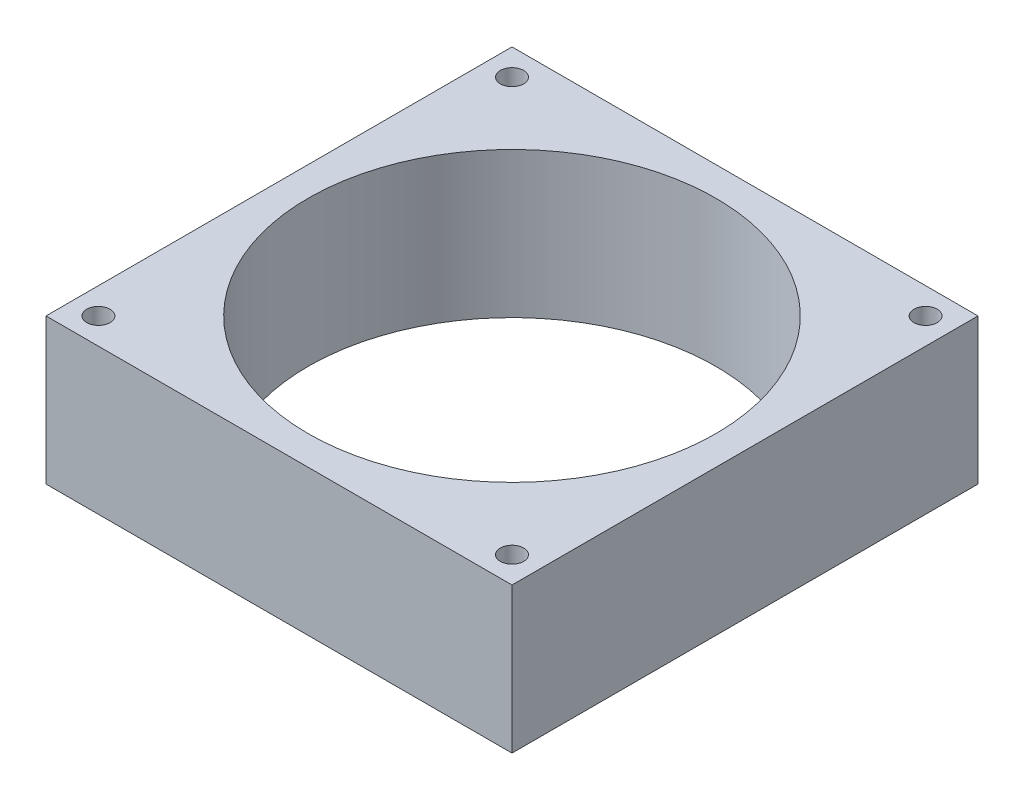
ISO-10303-21;
HEADER;
FILE_DESCRIPTION(('STEP AP214'),'2;1');
FILE_NAME('part.step','',(''),(''),'','','');
FILE_SCHEMA(('AUTOMOTIVE_DESIGN { 1 0 10303 214 1 1 1 1 }'));
ENDSEC;
DATA;
#1=APPLICATION_CONTEXT('core data for automotive mechanical design processes');
#2=APPLICATION_PROTOCOL_DEFINITION('international standard','automotive_design',2000,#1);
#3=PRODUCT_CONTEXT('',#1,'mechanical');
#4=PRODUCT('Part','Part','',(#3));
#5=PRODUCT_RELATED_PRODUCT_CATEGORY('part','',(#4));
#6=PRODUCT_DEFINITION_FORMATION('','',#4);
#7=PRODUCT_DEFINITION_CONTEXT('part definition',#1,'design');
#8=PRODUCT_DEFINITION('design','',#6,#7);
#9=PRODUCT_DEFINITION_SHAPE('','',#8);
#10=(LENGTH_UNIT() NAMED_UNIT(*) SI_UNIT(.MILLI.,.METRE.));
#11=(NAMED_UNIT(*) PLANE_ANGLE_UNIT() SI_UNIT($,.RADIAN.));
#12=(NAMED_UNIT(*) SI_UNIT($,.STERADIAN.) SOLID_ANGLE_UNIT());
#13=UNCERTAINTY_MEASURE_WITH_UNIT(LENGTH_MEASURE(1.E-05),#10,'distance_accuracy_value','');
#14=(GEOMETRIC_REPRESENTATION_CONTEXT(3) GLOBAL_UNCERTAINTY_ASSIGNED_CONTEXT((#13)) GLOBAL_UNIT_ASSIGNED_CONTEXT((#10,
#11,#12)) REPRESENTATION_CONTEXT('',''));
#15=CARTESIAN_POINT('',(0.,0.,0.));
#16=DIRECTION('',(0.,0.,1.));
#17=DIRECTION('',(1.,0.,0.));
#18=AXIS2_PLACEMENT_3D('',#15,#16,#17);
#19=CARTESIAN_POINT('',(0.,25.,0.));
#20=DIRECTION('',(0.,-1.,0.));
#21=DIRECTION('',(0.,0.,-1.));
#22=AXIS2_PLACEMENT_3D('',#19,#20,#21);
#23=PLANE('',#22);
#24=DIRECTION('',(0.,0.,-1.));
#25=VECTOR('',#24,1.);
#26=CARTESIAN_POINT('',(40.,25.,40.));
#27=LINE('',#26,#25);
#28=CARTESIAN_POINT('',(40.,25.,40.));
#29=VERTEX_POINT('',#28);
#30=CARTESIAN_POINT('',(40.,25.,-40.));
#31=VERTEX_POINT('',#30);
#32=EDGE_CURVE('E84',#29,#31,#27,.T.);
#33=ORIENTED_EDGE('',*,*,#32,.T.);
#34=DIRECTION('',(-1.,0.,0.));
#35=VECTOR('',#34,1.);
#36=CARTESIAN_POINT('',(-40.,25.,-40.));
#37=LINE('',#36,#35);
#38=CARTESIAN_POINT('',(-40.,25.,-40.));
#39=VERTEX_POINT('',#38);
#40=EDGE_CURVE('E79',#31,#39,#37,.T.);
#41=ORIENTED_EDGE('',*,*,#40,.T.);
#42=DIRECTION('',(0.,0.,1.));
#43=VECTOR('',#42,1.);
#44=CARTESIAN_POINT('',(-40.,25.,40.));
#45=LINE('',#44,#43);
#46=CARTESIAN_POINT('',(-40.,25.,40.));
#47=VERTEX_POINT('',#46);
#48=EDGE_CURVE('E82',#39,#47,#45,.T.);
#49=ORIENTED_EDGE('',*,*,#48,.T.);
#50=DIRECTION('',(1.,0.,0.));
#51=VECTOR('',#50,1.);
#52=CARTESIAN_POINT('',(-40.,25.,40.));
#53=LINE('',#52,#51);
#54=EDGE_CURVE('E49',#47,#29,#53,.T.);
#55=ORIENTED_EDGE('',*,*,#54,.T.);
#56=EDGE_LOOP('',(#33,#41,#49,#55));
#57=FACE_BOUND('',#56,.T.);
#58=CARTESIAN_POINT('',(-35.5,25.,-35.5));
#59=DIRECTION('',(0.,1.,0.));
#60=DIRECTION('',(0.,0.,1.));
#61=AXIS2_PLACEMENT_3D('',#58,#59,#60);
#62=CIRCLE('',#61,2.);
#63=CARTESIAN_POINT('',(-35.5,25.,-33.5));
#64=VERTEX_POINT('',#63);
#65=EDGE_CURVE('E99',#64,#64,#62,.T.);
#66=ORIENTED_EDGE('',*,*,#65,.F.);
#67=EDGE_LOOP('',(#66));
#68=FACE_BOUND('',#67,.T.);
#69=CARTESIAN_POINT('',(0.,25.,0.));
#70=DIRECTION('',(0.,1.,0.));
#71=DIRECTION('',(0.,0.,1.));
#72=AXIS2_PLACEMENT_3D('',#69,#70,#71);
#73=CIRCLE('',#72,35.);
#74=CARTESIAN_POINT('',(0.,25.,35.));
#75=VERTEX_POINT('',#74);
#76=EDGE_CURVE('E114',#75,#75,#73,.T.);
#77=ORIENTED_EDGE('',*,*,#76,.F.);
#78=EDGE_LOOP('',(#77));
#79=FACE_BOUND('',#78,.T.);
#80=CARTESIAN_POINT('',(35.5,25.,-35.5));
#81=DIRECTION('',(0.,1.,0.));
#82=DIRECTION('',(0.,0.,1.));
#83=AXIS2_PLACEMENT_3D('',#80,#81,#82);
#84=CIRCLE('',#83,2.);
#85=CARTESIAN_POINT('',(35.5,25.,-33.5));
#86=VERTEX_POINT('',#85);
#87=EDGE_CURVE('E120',#86,#86,#84,.T.);
#88=ORIENTED_EDGE('',*,*,#87,.F.);
#89=EDGE_LOOP('',(#88));
#90=FACE_BOUND('',#89,.T.);
#91=CARTESIAN_POINT('',(35.5000000000007,25.,35.5));
#92=DIRECTION('',(0.,1.,0.));
#93=DIRECTION('',(0.,0.,1.));
#94=AXIS2_PLACEMENT_3D('',#91,#92,#93);
#95=CIRCLE('',#94,2.);
#96=CARTESIAN_POINT('',(35.5000000000007,25.,37.5));
#97=VERTEX_POINT('',#96);
#98=EDGE_CURVE('E126',#97,#97,#95,.T.);
#99=ORIENTED_EDGE('',*,*,#98,.F.);
#100=EDGE_LOOP('',(#99));
#101=FACE_BOUND('',#100,.T.);
#102=CARTESIAN_POINT('',(-35.4999999999993,25.,35.5));
#103=DIRECTION('',(0.,1.,0.));
#104=DIRECTION('',(0.,0.,1.));
#105=AXIS2_PLACEMENT_3D('',#102,#103,#104);
#106=CIRCLE('',#105,2.);
#107=CARTESIAN_POINT('',(-35.4999999999993,25.,37.5));
#108=VERTEX_POINT('',#107);
#109=EDGE_CURVE('E132',#108,#108,#106,.T.);
#110=ORIENTED_EDGE('',*,*,#109,.F.);
#111=EDGE_LOOP('',(#110));
#112=FACE_BOUND('',#111,.T.);
#113=ADVANCED_FACE('F32',(#57,#68,#79,#90,#101,#112),#23,.F.);
#114=CARTESIAN_POINT('',(0.,0.,0.));
#115=DIRECTION('',(0.,-1.,0.));
#116=DIRECTION('',(0.,0.,-1.));
#117=AXIS2_PLACEMENT_3D('',#114,#115,#116);
#118=PLANE('',#117);
#119=CARTESIAN_POINT('',(35.5000000000007,0.,35.5));
#120=DIRECTION('',(0.,1.,0.));
#121=DIRECTION('',(0.,0.,1.));
#122=AXIS2_PLACEMENT_3D('',#119,#120,#121);
#123=CIRCLE('',#122,2.);
#124=CARTESIAN_POINT('',(35.5000000000007,0.,37.5));
#125=VERTEX_POINT('',#124);
#126=EDGE_CURVE('E129',#125,#125,#123,.T.);
#127=ORIENTED_EDGE('',*,*,#126,.T.);
#128=EDGE_LOOP('',(#127));
#129=FACE_BOUND('',#128,.T.);
#130=CARTESIAN_POINT('',(0.,0.,0.));
#131=DIRECTION('',(0.,1.,0.));
#132=DIRECTION('',(0.,0.,1.));
#133=AXIS2_PLACEMENT_3D('',#130,#131,#132);
#134=CIRCLE('',#133,35.);
#135=CARTESIAN_POINT('',(0.,0.,35.));
#136=VERTEX_POINT('',#135);
#137=EDGE_CURVE('E117',#136,#136,#134,.T.);
#138=ORIENTED_EDGE('',*,*,#137,.T.);
#139=EDGE_LOOP('',(#138));
#140=FACE_BOUND('',#139,.T.);
#141=DIRECTION('',(0.,0.,-1.));
#142=VECTOR('',#141,1.);
#143=CARTESIAN_POINT('',(40.,0.,40.));
#144=LINE('',#143,#142);
#145=CARTESIAN_POINT('',(40.,0.,40.));
#146=VERTEX_POINT('',#145);
#147=CARTESIAN_POINT('',(40.,0.,-40.));
#148=VERTEX_POINT('',#147);
#149=EDGE_CURVE('E96',#146,#148,#144,.T.);
#150=ORIENTED_EDGE('',*,*,#149,.F.);
#151=DIRECTION('',(1.,0.,0.));
#152=VECTOR('',#151,1.);
#153=CARTESIAN_POINT('',(-40.,0.,40.));
#154=LINE('',#153,#152);
#155=CARTESIAN_POINT('',(-40.,0.,40.));
#156=VERTEX_POINT('',#155);
#157=EDGE_CURVE('E72',#156,#146,#154,.T.);
#158=ORIENTED_EDGE('',*,*,#157,.F.);
#159=DIRECTION('',(0.,0.,1.));
#160=VECTOR('',#159,1.);
#161=CARTESIAN_POINT('',(-40.,0.,40.));
#162=LINE('',#161,#160);
#163=CARTESIAN_POINT('',(-40.,0.,-40.));
#164=VERTEX_POINT('',#163);
#165=EDGE_CURVE('E66',#164,#156,#162,.T.);
#166=ORIENTED_EDGE('',*,*,#165,.F.);
#167=DIRECTION('',(-1.,0.,0.));
#168=VECTOR('',#167,1.);
#169=CARTESIAN_POINT('',(-40.,0.,-40.));
#170=LINE('',#169,#168);
#171=EDGE_CURVE('E88',#148,#164,#170,.T.);
#172=ORIENTED_EDGE('',*,*,#171,.F.);
#173=EDGE_LOOP('',(#150,#158,#166,#172));
#174=FACE_BOUND('',#173,.T.);
#175=CARTESIAN_POINT('',(-35.5,0.,-35.5));
#176=DIRECTION('',(0.,1.,0.));
#177=DIRECTION('',(0.,0.,1.));
#178=AXIS2_PLACEMENT_3D('',#175,#176,#177);
#179=CIRCLE('',#178,2.);
#180=CARTESIAN_POINT('',(-35.5,0.,-33.5));
#181=VERTEX_POINT('',#180);
#182=EDGE_CURVE('E111',#181,#181,#179,.T.);
#183=ORIENTED_EDGE('',*,*,#182,.T.);
#184=EDGE_LOOP('',(#183));
#185=FACE_BOUND('',#184,.T.);
#186=CARTESIAN_POINT('',(35.5,0.,-35.5));
#187=DIRECTION('',(0.,1.,0.));
#188=DIRECTION('',(0.,0.,1.));
#189=AXIS2_PLACEMENT_3D('',#186,#187,#188);
#190=CIRCLE('',#189,2.);
#191=CARTESIAN_POINT('',(35.5,0.,-33.5));
#192=VERTEX_POINT('',#191);
#193=EDGE_CURVE('E123',#192,#192,#190,.T.);
#194=ORIENTED_EDGE('',*,*,#193,.T.);
#195=EDGE_LOOP('',(#194));
#196=FACE_BOUND('',#195,.T.);
#197=CARTESIAN_POINT('',(-35.4999999999993,0.,35.5));
#198=DIRECTION('',(0.,1.,0.));
#199=DIRECTION('',(0.,0.,1.));
#200=AXIS2_PLACEMENT_3D('',#197,#198,#199);
#201=CIRCLE('',#200,2.);
#202=CARTESIAN_POINT('',(-35.4999999999993,0.,37.5));
#203=VERTEX_POINT('',#202);
#204=EDGE_CURVE('E135',#203,#203,#201,.T.);
#205=ORIENTED_EDGE('',*,*,#204,.T.);
#206=EDGE_LOOP('',(#205));
#207=FACE_BOUND('',#206,.T.);
#208=ADVANCED_FACE('F107',(#129,#140,#174,#185,#196,#207),#118,.T.);
#209=CARTESIAN_POINT('',(40.,25.,40.));
#210=DIRECTION('',(-1.,0.,0.));
#211=DIRECTION('',(0.,0.,1.));
#212=AXIS2_PLACEMENT_3D('',#209,#210,#211);
#213=PLANE('',#212);
#214=ORIENTED_EDGE('',*,*,#149,.T.);
#215=DIRECTION('',(0.,-1.,0.));
#216=VECTOR('',#215,1.);
#217=CARTESIAN_POINT('',(40.,25.,-40.));
#218=LINE('',#217,#216);
#219=EDGE_CURVE('E11',#31,#148,#218,.T.);
#220=ORIENTED_EDGE('',*,*,#219,.F.);
#221=ORIENTED_EDGE('',*,*,#32,.F.);
#222=DIRECTION('',(0.,-1.,0.));
#223=VECTOR('',#222,1.);
#224=CARTESIAN_POINT('',(40.,25.,40.));
#225=LINE('',#224,#223);
#226=EDGE_CURVE('E92',#29,#146,#225,.T.);
#227=ORIENTED_EDGE('',*,*,#226,.T.);
#228=EDGE_LOOP('',(#214,#220,#221,#227));
#229=FACE_BOUND('',#228,.T.);
#230=ADVANCED_FACE('F34',(#229),#213,.F.);
#231=CARTESIAN_POINT('',(-40.,25.,-40.));
#232=DIRECTION('',(0.,0.,1.));
#233=DIRECTION('',(1.,0.,0.));
#234=AXIS2_PLACEMENT_3D('',#231,#232,#233);
#235=PLANE('',#234);
#236=ORIENTED_EDGE('',*,*,#171,.T.);
#237=DIRECTION('',(0.,-1.,0.));
#238=VECTOR('',#237,1.);
#239=CARTESIAN_POINT('',(-40.,25.,-40.));
#240=LINE('',#239,#238);
#241=EDGE_CURVE('E41',#39,#164,#240,.T.);
#242=ORIENTED_EDGE('',*,*,#241,.F.);
#243=ORIENTED_EDGE('',*,*,#40,.F.);
#244=ORIENTED_EDGE('',*,*,#219,.T.);
#245=EDGE_LOOP('',(#236,#242,#243,#244));
#246=FACE_BOUND('',#245,.T.);
#247=ADVANCED_FACE('F87',(#246),#235,.F.);
#248=CARTESIAN_POINT('',(-40.,25.,40.));
#249=DIRECTION('',(1.,0.,0.));
#250=DIRECTION('',(0.,0.,-1.));
#251=AXIS2_PLACEMENT_3D('',#248,#249,#250);
#252=PLANE('',#251);
#253=ORIENTED_EDGE('',*,*,#165,.T.);
#254=DIRECTION('',(0.,-1.,0.));
#255=VECTOR('',#254,1.);
#256=CARTESIAN_POINT('',(-40.,25.,40.));
#257=LINE('',#256,#255);
#258=EDGE_CURVE('E89',#47,#156,#257,.T.);
#259=ORIENTED_EDGE('',*,*,#258,.F.);
#260=ORIENTED_EDGE('',*,*,#48,.F.);
#261=ORIENTED_EDGE('',*,*,#241,.T.);
#262=EDGE_LOOP('',(#253,#259,#260,#261));
#263=FACE_BOUND('',#262,.T.);
#264=ADVANCED_FACE('F90',(#263),#252,.F.);
#265=CARTESIAN_POINT('',(-40.,25.,40.));
#266=DIRECTION('',(0.,0.,-1.));
#267=DIRECTION('',(-1.,0.,0.));
#268=AXIS2_PLACEMENT_3D('',#265,#266,#267);
#269=PLANE('',#268);
#270=ORIENTED_EDGE('',*,*,#157,.T.);
#271=ORIENTED_EDGE('',*,*,#226,.F.);
#272=ORIENTED_EDGE('',*,*,#54,.F.);
#273=ORIENTED_EDGE('',*,*,#258,.T.);
#274=EDGE_LOOP('',(#270,#271,#272,#273));
#275=FACE_BOUND('',#274,.T.);
#276=ADVANCED_FACE('F104',(#275),#269,.F.);
#277=CARTESIAN_POINT('',(-35.5,25.,-35.5));
#278=DIRECTION('',(0.,-1.,0.));
#279=DIRECTION('',(0.,0.,-1.));
#280=AXIS2_PLACEMENT_3D('',#277,#278,#279);
#281=CYLINDRICAL_SURFACE('',#280,2.);
#282=ORIENTED_EDGE('',*,*,#65,.T.);
#283=EDGE_LOOP('',(#282));
#284=FACE_BOUND('',#283,.T.);
#285=ORIENTED_EDGE('',*,*,#182,.F.);
#286=EDGE_LOOP('',(#285));
#287=FACE_BOUND('',#286,.T.);
#288=ADVANCED_FACE('F152',(#284,#287),#281,.F.);
#289=CARTESIAN_POINT('',(0.,25.,0.));
#290=DIRECTION('',(0.,-1.,0.));
#291=DIRECTION('',(0.,0.,-1.));
#292=AXIS2_PLACEMENT_3D('',#289,#290,#291);
#293=CYLINDRICAL_SURFACE('',#292,35.);
#294=ORIENTED_EDGE('',*,*,#76,.T.);
#295=EDGE_LOOP('',(#294));
#296=FACE_BOUND('',#295,.T.);
#297=ORIENTED_EDGE('',*,*,#137,.F.);
#298=EDGE_LOOP('',(#297));
#299=FACE_BOUND('',#298,.T.);
#300=ADVANCED_FACE('F198',(#296,#299),#293,.F.);
#301=CARTESIAN_POINT('',(35.5,25.,-35.5));
#302=DIRECTION('',(0.,-1.,0.));
#303=DIRECTION('',(0.,0.,-1.));
#304=AXIS2_PLACEMENT_3D('',#301,#302,#303);
#305=CYLINDRICAL_SURFACE('',#304,2.);
#306=ORIENTED_EDGE('',*,*,#87,.T.);
#307=EDGE_LOOP('',(#306));
#308=FACE_BOUND('',#307,.T.);
#309=ORIENTED_EDGE('',*,*,#193,.F.);
#310=EDGE_LOOP('',(#309));
#311=FACE_BOUND('',#310,.T.);
#312=ADVANCED_FACE('F206',(#308,#311),#305,.F.);
#313=CARTESIAN_POINT('',(35.5000000000007,25.,35.5));
#314=DIRECTION('',(0.,-1.,0.));
#315=DIRECTION('',(0.,0.,-1.));
#316=AXIS2_PLACEMENT_3D('',#313,#314,#315);
#317=CYLINDRICAL_SURFACE('',#316,2.);
#318=ORIENTED_EDGE('',*,*,#98,.T.);
#319=EDGE_LOOP('',(#318));
#320=FACE_BOUND('',#319,.T.);
#321=ORIENTED_EDGE('',*,*,#126,.F.);
#322=EDGE_LOOP('',(#321));
#323=FACE_BOUND('',#322,.T.);
#324=ADVANCED_FACE('F214',(#320,#323),#317,.F.);
#325=CARTESIAN_POINT('',(-35.4999999999993,25.,35.5));
#326=DIRECTION('',(0.,-1.,0.));
#327=DIRECTION('',(0.,0.,-1.));
#328=AXIS2_PLACEMENT_3D('',#325,#326,#327);
#329=CYLINDRICAL_SURFACE('',#328,2.);
#330=ORIENTED_EDGE('',*,*,#109,.T.);
#331=EDGE_LOOP('',(#330));
#332=FACE_BOUND('',#331,.T.);
#333=ORIENTED_EDGE('',*,*,#204,.F.);
#334=EDGE_LOOP('',(#333));
#335=FACE_BOUND('',#334,.T.);
#336=ADVANCED_FACE('F141',(#332,#335),#329,.F.);
#337=CLOSED_SHELL('',(#113,#208,#230,#247,#264,#276,#288,#300,#312,#324,#336));
#338=MANIFOLD_SOLID_BREP('B2',#337);
#339=ADVANCED_BREP_SHAPE_REPRESENTATION('',(#18,#338),#14);
#340=SHAPE_DEFINITION_REPRESENTATION(#9,#339);
ENDSEC;
END-ISO-10303-21;
